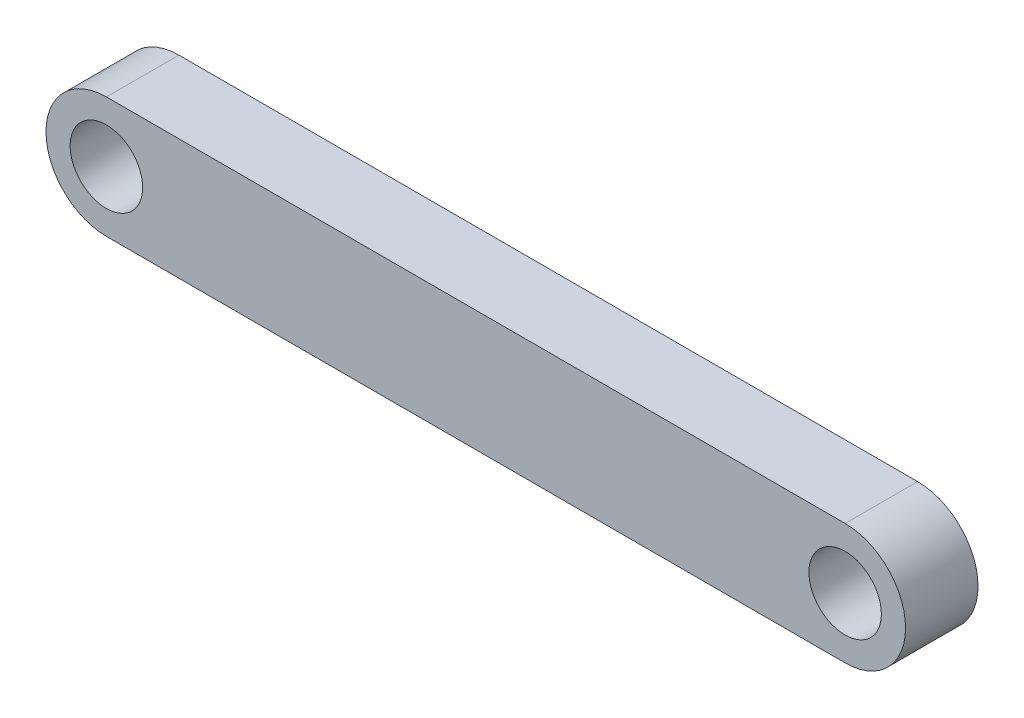
ISO-10303-21;
HEADER;
FILE_DESCRIPTION(('STEP AP214'),'2;1');
FILE_NAME('part.step','',(''),(''),'','','');
FILE_SCHEMA(('AUTOMOTIVE_DESIGN { 1 0 10303 214 1 1 1 1 }'));
ENDSEC;
DATA;
#1=APPLICATION_CONTEXT('core data for automotive mechanical design processes');
#2=APPLICATION_PROTOCOL_DEFINITION('international standard','automotive_design',2000,#1);
#3=PRODUCT_CONTEXT('',#1,'mechanical');
#4=PRODUCT('Part','Part','',(#3));
#5=PRODUCT_RELATED_PRODUCT_CATEGORY('part','',(#4));
#6=PRODUCT_DEFINITION_FORMATION('','',#4);
#7=PRODUCT_DEFINITION_CONTEXT('part definition',#1,'design');
#8=PRODUCT_DEFINITION('design','',#6,#7);
#9=PRODUCT_DEFINITION_SHAPE('','',#8);
#10=(LENGTH_UNIT() NAMED_UNIT(*) SI_UNIT(.MILLI.,.METRE.));
#11=(NAMED_UNIT(*) PLANE_ANGLE_UNIT() SI_UNIT($,.RADIAN.));
#12=(NAMED_UNIT(*) SI_UNIT($,.STERADIAN.) SOLID_ANGLE_UNIT());
#13=UNCERTAINTY_MEASURE_WITH_UNIT(LENGTH_MEASURE(1.E-05),#10,'distance_accuracy_value','');
#14=(GEOMETRIC_REPRESENTATION_CONTEXT(3) GLOBAL_UNCERTAINTY_ASSIGNED_CONTEXT((#13)) GLOBAL_UNIT_ASSIGNED_CONTEXT((#10,
#11,#12)) REPRESENTATION_CONTEXT('',''));
#15=CARTESIAN_POINT('',(0.,0.,0.));
#16=DIRECTION('',(0.,0.,1.));
#17=DIRECTION('',(1.,0.,0.));
#18=AXIS2_PLACEMENT_3D('',#15,#16,#17);
#19=CARTESIAN_POINT('',(0.,0.,3.));
#20=DIRECTION('',(0.,0.,1.));
#21=DIRECTION('',(1.,0.,0.));
#22=AXIS2_PLACEMENT_3D('',#19,#20,#21);
#23=PLANE('',#22);
#24=CARTESIAN_POINT('',(0.,0.,3.));
#25=DIRECTION('',(0.,0.,1.));
#26=DIRECTION('',(1.,0.,0.));
#27=AXIS2_PLACEMENT_3D('',#24,#25,#26);
#28=CIRCLE('',#27,1.5);
#29=CARTESIAN_POINT('',(1.5,0.,3.));
#30=VERTEX_POINT('',#29);
#31=EDGE_CURVE('E105',#30,#30,#28,.T.);
#32=ORIENTED_EDGE('',*,*,#31,.F.);
#33=EDGE_LOOP('',(#32));
#34=FACE_BOUND('',#33,.T.);
#35=CARTESIAN_POINT('',(0.,0.,3.));
#36=DIRECTION('',(0.,0.,1.));
#37=DIRECTION('',(1.,0.,0.));
#38=AXIS2_PLACEMENT_3D('',#35,#36,#37);
#39=CIRCLE('',#38,2.5);
#40=CARTESIAN_POINT('',(0.,2.5,3.));
#41=VERTEX_POINT('',#40);
#42=CARTESIAN_POINT('',(0.,-2.5,3.));
#43=VERTEX_POINT('',#42);
#44=EDGE_CURVE('E90',#41,#43,#39,.T.);
#45=ORIENTED_EDGE('',*,*,#44,.T.);
#46=DIRECTION('',(1.,0.,0.));
#47=VECTOR('',#46,1.);
#48=CARTESIAN_POINT('',(0.,-2.5,3.));
#49=LINE('',#48,#47);
#50=CARTESIAN_POINT('',(30.58,-2.5,3.));
#51=VERTEX_POINT('',#50);
#52=EDGE_CURVE('E85',#43,#51,#49,.T.);
#53=ORIENTED_EDGE('',*,*,#52,.T.);
#54=CARTESIAN_POINT('',(30.58,0.,3.));
#55=DIRECTION('',(0.,0.,1.));
#56=DIRECTION('',(1.,0.,0.));
#57=AXIS2_PLACEMENT_3D('',#54,#55,#56);
#58=CIRCLE('',#57,2.5);
#59=CARTESIAN_POINT('',(30.58,2.5,3.));
#60=VERTEX_POINT('',#59);
#61=EDGE_CURVE('E88',#51,#60,#58,.T.);
#62=ORIENTED_EDGE('',*,*,#61,.T.);
#63=DIRECTION('',(-1.,0.,0.));
#64=VECTOR('',#63,1.);
#65=CARTESIAN_POINT('',(0.,2.5,3.));
#66=LINE('',#65,#64);
#67=EDGE_CURVE('E55',#60,#41,#66,.T.);
#68=ORIENTED_EDGE('',*,*,#67,.T.);
#69=EDGE_LOOP('',(#45,#53,#62,#68));
#70=FACE_BOUND('',#69,.T.);
#71=CARTESIAN_POINT('',(30.58,0.,3.));
#72=DIRECTION('',(0.,0.,1.));
#73=DIRECTION('',(1.,0.,0.));
#74=AXIS2_PLACEMENT_3D('',#71,#72,#73);
#75=CIRCLE('',#74,1.50000000000001);
#76=CARTESIAN_POINT('',(32.08,0.,3.));
#77=VERTEX_POINT('',#76);
#78=EDGE_CURVE('E120',#77,#77,#75,.T.);
#79=ORIENTED_EDGE('',*,*,#78,.F.);
#80=EDGE_LOOP('',(#79));
#81=FACE_BOUND('',#80,.T.);
#82=ADVANCED_FACE('F38',(#34,#70,#81),#23,.T.);
#83=CARTESIAN_POINT('',(0.,0.,0.));
#84=DIRECTION('',(0.,0.,1.));
#85=DIRECTION('',(1.,0.,0.));
#86=AXIS2_PLACEMENT_3D('',#83,#84,#85);
#87=PLANE('',#86);
#88=CARTESIAN_POINT('',(0.,0.,0.));
#89=DIRECTION('',(0.,0.,1.));
#90=DIRECTION('',(1.,0.,0.));
#91=AXIS2_PLACEMENT_3D('',#88,#89,#90);
#92=CIRCLE('',#91,2.5);
#93=CARTESIAN_POINT('',(0.,2.5,0.));
#94=VERTEX_POINT('',#93);
#95=CARTESIAN_POINT('',(0.,-2.5,0.));
#96=VERTEX_POINT('',#95);
#97=EDGE_CURVE('E102',#94,#96,#92,.T.);
#98=ORIENTED_EDGE('',*,*,#97,.F.);
#99=DIRECTION('',(-1.,0.,0.));
#100=VECTOR('',#99,1.);
#101=CARTESIAN_POINT('',(0.,2.5,0.));
#102=LINE('',#101,#100);
#103=CARTESIAN_POINT('',(30.58,2.5,0.));
#104=VERTEX_POINT('',#103);
#105=EDGE_CURVE('E78',#104,#94,#102,.T.);
#106=ORIENTED_EDGE('',*,*,#105,.F.);
#107=CARTESIAN_POINT('',(30.58,0.,0.));
#108=DIRECTION('',(0.,0.,1.));
#109=DIRECTION('',(1.,0.,0.));
#110=AXIS2_PLACEMENT_3D('',#107,#108,#109);
#111=CIRCLE('',#110,2.5);
#112=CARTESIAN_POINT('',(30.58,-2.5,0.));
#113=VERTEX_POINT('',#112);
#114=EDGE_CURVE('E72',#113,#104,#111,.T.);
#115=ORIENTED_EDGE('',*,*,#114,.F.);
#116=DIRECTION('',(1.,0.,0.));
#117=VECTOR('',#116,1.);
#118=CARTESIAN_POINT('',(0.,-2.5,0.));
#119=LINE('',#118,#117);
#120=EDGE_CURVE('E94',#96,#113,#119,.T.);
#121=ORIENTED_EDGE('',*,*,#120,.F.);
#122=EDGE_LOOP('',(#98,#106,#115,#121));
#123=FACE_BOUND('',#122,.T.);
#124=CARTESIAN_POINT('',(0.,0.,0.));
#125=DIRECTION('',(0.,0.,1.));
#126=DIRECTION('',(1.,0.,0.));
#127=AXIS2_PLACEMENT_3D('',#124,#125,#126);
#128=CIRCLE('',#127,1.5);
#129=CARTESIAN_POINT('',(1.5,0.,0.));
#130=VERTEX_POINT('',#129);
#131=EDGE_CURVE('E117',#130,#130,#128,.T.);
#132=ORIENTED_EDGE('',*,*,#131,.T.);
#133=EDGE_LOOP('',(#132));
#134=FACE_BOUND('',#133,.T.);
#135=CARTESIAN_POINT('',(30.58,0.,0.));
#136=DIRECTION('',(0.,0.,1.));
#137=DIRECTION('',(1.,0.,0.));
#138=AXIS2_PLACEMENT_3D('',#135,#136,#137);
#139=CIRCLE('',#138,1.50000000000001);
#140=CARTESIAN_POINT('',(32.08,0.,0.));
#141=VERTEX_POINT('',#140);
#142=EDGE_CURVE('E123',#141,#141,#139,.T.);
#143=ORIENTED_EDGE('',*,*,#142,.T.);
#144=EDGE_LOOP('',(#143));
#145=FACE_BOUND('',#144,.T.);
#146=ADVANCED_FACE('F113',(#123,#134,#145),#87,.F.);
#147=CARTESIAN_POINT('',(0.,0.,3.));
#148=DIRECTION('',(0.,0.,-1.));
#149=DIRECTION('',(-1.,0.,0.));
#150=AXIS2_PLACEMENT_3D('',#147,#148,#149);
#151=CYLINDRICAL_SURFACE('',#150,2.5);
#152=ORIENTED_EDGE('',*,*,#97,.T.);
#153=DIRECTION('',(0.,0.,-1.));
#154=VECTOR('',#153,1.);
#155=CARTESIAN_POINT('',(0.,-2.5,3.));
#156=LINE('',#155,#154);
#157=EDGE_CURVE('E11',#43,#96,#156,.T.);
#158=ORIENTED_EDGE('',*,*,#157,.F.);
#159=ORIENTED_EDGE('',*,*,#44,.F.);
#160=DIRECTION('',(0.,0.,-1.));
#161=VECTOR('',#160,1.);
#162=CARTESIAN_POINT('',(0.,2.5,3.));
#163=LINE('',#162,#161);
#164=EDGE_CURVE('E98',#41,#94,#163,.T.);
#165=ORIENTED_EDGE('',*,*,#164,.T.);
#166=EDGE_LOOP('',(#152,#158,#159,#165));
#167=FACE_BOUND('',#166,.T.);
#168=ADVANCED_FACE('F40',(#167),#151,.T.);
#169=CARTESIAN_POINT('',(0.,-2.5,3.));
#170=DIRECTION('',(0.,1.,0.));
#171=DIRECTION('',(0.,0.,1.));
#172=AXIS2_PLACEMENT_3D('',#169,#170,#171);
#173=PLANE('',#172);
#174=ORIENTED_EDGE('',*,*,#120,.T.);
#175=DIRECTION('',(0.,0.,-1.));
#176=VECTOR('',#175,1.);
#177=CARTESIAN_POINT('',(30.58,-2.5,3.));
#178=LINE('',#177,#176);
#179=EDGE_CURVE('E47',#51,#113,#178,.T.);
#180=ORIENTED_EDGE('',*,*,#179,.F.);
#181=ORIENTED_EDGE('',*,*,#52,.F.);
#182=ORIENTED_EDGE('',*,*,#157,.T.);
#183=EDGE_LOOP('',(#174,#180,#181,#182));
#184=FACE_BOUND('',#183,.T.);
#185=ADVANCED_FACE('F93',(#184),#173,.F.);
#186=CARTESIAN_POINT('',(30.58,0.,3.));
#187=DIRECTION('',(0.,0.,-1.));
#188=DIRECTION('',(-1.,0.,0.));
#189=AXIS2_PLACEMENT_3D('',#186,#187,#188);
#190=CYLINDRICAL_SURFACE('',#189,2.5);
#191=ORIENTED_EDGE('',*,*,#114,.T.);
#192=DIRECTION('',(0.,0.,-1.));
#193=VECTOR('',#192,1.);
#194=CARTESIAN_POINT('',(30.58,2.5,3.));
#195=LINE('',#194,#193);
#196=EDGE_CURVE('E95',#60,#104,#195,.T.);
#197=ORIENTED_EDGE('',*,*,#196,.F.);
#198=ORIENTED_EDGE('',*,*,#61,.F.);
#199=ORIENTED_EDGE('',*,*,#179,.T.);
#200=EDGE_LOOP('',(#191,#197,#198,#199));
#201=FACE_BOUND('',#200,.T.);
#202=ADVANCED_FACE('F96',(#201),#190,.T.);
#203=CARTESIAN_POINT('',(0.,2.5,3.));
#204=DIRECTION('',(0.,-1.,0.));
#205=DIRECTION('',(0.,0.,-1.));
#206=AXIS2_PLACEMENT_3D('',#203,#204,#205);
#207=PLANE('',#206);
#208=ORIENTED_EDGE('',*,*,#105,.T.);
#209=ORIENTED_EDGE('',*,*,#164,.F.);
#210=ORIENTED_EDGE('',*,*,#67,.F.);
#211=ORIENTED_EDGE('',*,*,#196,.T.);
#212=EDGE_LOOP('',(#208,#209,#210,#211));
#213=FACE_BOUND('',#212,.T.);
#214=ADVANCED_FACE('F110',(#213),#207,.F.);
#215=CARTESIAN_POINT('',(0.,0.,3.));
#216=DIRECTION('',(0.,0.,-1.));
#217=DIRECTION('',(-1.,0.,0.));
#218=AXIS2_PLACEMENT_3D('',#215,#216,#217);
#219=CYLINDRICAL_SURFACE('',#218,1.5);
#220=ORIENTED_EDGE('',*,*,#31,.T.);
#221=EDGE_LOOP('',(#220));
#222=FACE_BOUND('',#221,.T.);
#223=ORIENTED_EDGE('',*,*,#131,.F.);
#224=EDGE_LOOP('',(#223));
#225=FACE_BOUND('',#224,.T.);
#226=ADVANCED_FACE('F140',(#222,#225),#219,.F.);
#227=CARTESIAN_POINT('',(30.58,0.,3.));
#228=DIRECTION('',(0.,0.,-1.));
#229=DIRECTION('',(-1.,0.,0.));
#230=AXIS2_PLACEMENT_3D('',#227,#228,#229);
#231=CYLINDRICAL_SURFACE('',#230,1.50000000000001);
#232=ORIENTED_EDGE('',*,*,#78,.T.);
#233=EDGE_LOOP('',(#232));
#234=FACE_BOUND('',#233,.T.);
#235=ORIENTED_EDGE('',*,*,#142,.F.);
#236=EDGE_LOOP('',(#235));
#237=FACE_BOUND('',#236,.T.);
#238=ADVANCED_FACE('F129',(#234,#237),#231,.F.);
#239=CLOSED_SHELL('',(#82,#146,#168,#185,#202,#214,#226,#238));
#240=MANIFOLD_SOLID_BREP('B2',#239);
#241=ADVANCED_BREP_SHAPE_REPRESENTATION('',(#18,#240),#14);
#242=SHAPE_DEFINITION_REPRESENTATION(#9,#241);
ENDSEC;
END-ISO-10303-21;
